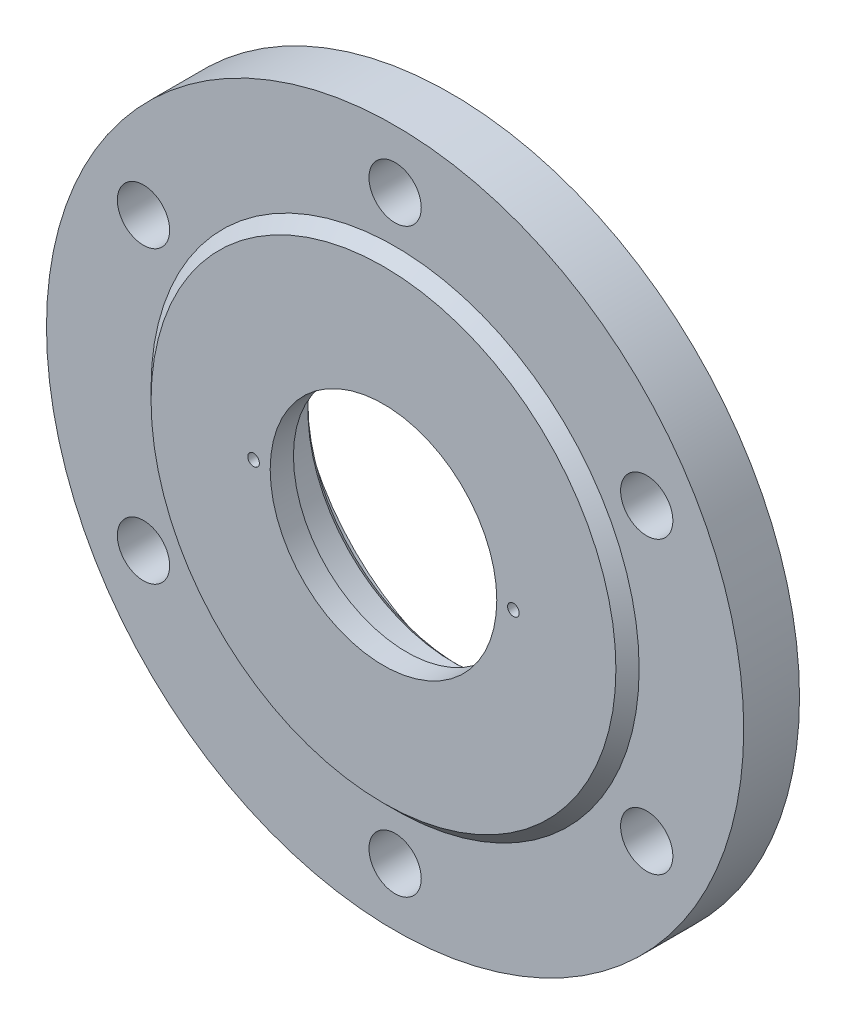
ISO-10303-21;
HEADER;
FILE_DESCRIPTION(('STEP AP214'),'2;1');
FILE_NAME('part.step','',(''),(''),'','','');
FILE_SCHEMA(('AUTOMOTIVE_DESIGN { 1 0 10303 214 1 1 1 1 }'));
ENDSEC;
DATA;
#1=APPLICATION_CONTEXT('core data for automotive mechanical design processes');
#2=APPLICATION_PROTOCOL_DEFINITION('international standard','automotive_design',2000,#1);
#3=PRODUCT_CONTEXT('',#1,'mechanical');
#4=PRODUCT('Part','Part','',(#3));
#5=PRODUCT_RELATED_PRODUCT_CATEGORY('part','',(#4));
#6=PRODUCT_DEFINITION_FORMATION('','',#4);
#7=PRODUCT_DEFINITION_CONTEXT('part definition',#1,'design');
#8=PRODUCT_DEFINITION('design','',#6,#7);
#9=PRODUCT_DEFINITION_SHAPE('','',#8);
#10=(LENGTH_UNIT() NAMED_UNIT(*) SI_UNIT(.MILLI.,.METRE.));
#11=(NAMED_UNIT(*) PLANE_ANGLE_UNIT() SI_UNIT($,.RADIAN.));
#12=(NAMED_UNIT(*) SI_UNIT($,.STERADIAN.) SOLID_ANGLE_UNIT());
#13=UNCERTAINTY_MEASURE_WITH_UNIT(LENGTH_MEASURE(1.E-05),#10,'distance_accuracy_value','');
#14=(GEOMETRIC_REPRESENTATION_CONTEXT(3) GLOBAL_UNCERTAINTY_ASSIGNED_CONTEXT((#13)) GLOBAL_UNIT_ASSIGNED_CONTEXT((#10,
#11,#12)) REPRESENTATION_CONTEXT('',''));
#15=CARTESIAN_POINT('',(0.,0.,0.));
#16=DIRECTION('',(0.,0.,1.));
#17=DIRECTION('',(1.,0.,0.));
#18=AXIS2_PLACEMENT_3D('',#15,#16,#17);
#19=CARTESIAN_POINT('',(0.,0.,-2.));
#20=DIRECTION('',(0.,0.,-1.));
#21=DIRECTION('',(-1.,0.,0.));
#22=AXIS2_PLACEMENT_3D('',#19,#20,#21);
#23=CONICAL_SURFACE('',#22,42.,0.785398163397449);
#24=CARTESIAN_POINT('',(0.,0.,0.));
#25=DIRECTION('',(0.,0.,1.));
#26=DIRECTION('',(1.,0.,0.));
#27=AXIS2_PLACEMENT_3D('',#24,#25,#26);
#28=CIRCLE('',#27,40.);
#29=CARTESIAN_POINT('',(40.,0.,0.));
#30=VERTEX_POINT('',#29);
#31=EDGE_CURVE('E10',#30,#30,#28,.T.);
#32=ORIENTED_EDGE('',*,*,#31,.F.);
#33=EDGE_LOOP('',(#32));
#34=FACE_BOUND('',#33,.T.);
#35=CARTESIAN_POINT('',(0.,0.,-2.));
#36=DIRECTION('',(0.,0.,1.));
#37=DIRECTION('',(1.,0.,0.));
#38=AXIS2_PLACEMENT_3D('',#35,#36,#37);
#39=CIRCLE('',#38,42.);
#40=CARTESIAN_POINT('',(42.,0.,-2.));
#41=VERTEX_POINT('',#40);
#42=EDGE_CURVE('E91',#41,#41,#39,.T.);
#43=ORIENTED_EDGE('',*,*,#42,.T.);
#44=EDGE_LOOP('',(#43));
#45=FACE_BOUND('',#44,.T.);
#46=ADVANCED_FACE('F39',(#34,#45),#23,.T.);
#47=CARTESIAN_POINT('',(0.,19.5,0.));
#48=DIRECTION('',(0.,0.,-1.));
#49=DIRECTION('',(-1.,0.,0.));
#50=AXIS2_PLACEMENT_3D('',#47,#48,#49);
#51=PLANE('',#50);
#52=CARTESIAN_POINT('',(-22.3599999999999,0.,0.));
#53=DIRECTION('',(0.,0.,1.));
#54=DIRECTION('',(1.,0.,0.));
#55=AXIS2_PLACEMENT_3D('',#52,#53,#54);
#56=CIRCLE('',#55,1.);
#57=CARTESIAN_POINT('',(-21.3599999999999,0.,0.));
#58=VERTEX_POINT('',#57);
#59=EDGE_CURVE('E134',#58,#58,#56,.T.);
#60=ORIENTED_EDGE('',*,*,#59,.F.);
#61=EDGE_LOOP('',(#60));
#62=FACE_BOUND('',#61,.T.);
#63=CARTESIAN_POINT('',(22.3600000000001,0.,0.));
#64=DIRECTION('',(0.,0.,1.));
#65=DIRECTION('',(-1.,0.,0.));
#66=AXIS2_PLACEMENT_3D('',#63,#64,#65);
#67=CIRCLE('',#66,1.);
#68=CARTESIAN_POINT('',(21.3600000000001,0.,0.));
#69=VERTEX_POINT('',#68);
#70=EDGE_CURVE('E135',#69,#69,#67,.T.);
#71=ORIENTED_EDGE('',*,*,#70,.F.);
#72=EDGE_LOOP('',(#71));
#73=FACE_BOUND('',#72,.T.);
#74=CARTESIAN_POINT('',(0.,0.,0.));
#75=DIRECTION('',(0.,0.,1.));
#76=DIRECTION('',(1.,0.,0.));
#77=AXIS2_PLACEMENT_3D('',#74,#75,#76);
#78=CIRCLE('',#77,19.5);
#79=CARTESIAN_POINT('',(19.5,0.,0.));
#80=VERTEX_POINT('',#79);
#81=EDGE_CURVE('E45',#80,#80,#78,.T.);
#82=ORIENTED_EDGE('',*,*,#81,.F.);
#83=EDGE_LOOP('',(#82));
#84=FACE_BOUND('',#83,.T.);
#85=ORIENTED_EDGE('',*,*,#31,.T.);
#86=EDGE_LOOP('',(#85));
#87=FACE_BOUND('',#86,.T.);
#88=ADVANCED_FACE('F146',(#62,#73,#84,#87),#51,.F.);
#89=CARTESIAN_POINT('',(0.,0.,0.));
#90=DIRECTION('',(0.,0.,1.));
#91=DIRECTION('',(1.,0.,0.));
#92=AXIS2_PLACEMENT_3D('',#89,#90,#91);
#93=CYLINDRICAL_SURFACE('',#92,19.5);
#94=CARTESIAN_POINT('',(0.,0.,-4.));
#95=DIRECTION('',(0.,0.,1.));
#96=DIRECTION('',(1.,0.,0.));
#97=AXIS2_PLACEMENT_3D('',#94,#95,#96);
#98=CIRCLE('',#97,19.5);
#99=CARTESIAN_POINT('',(19.5,0.,-4.));
#100=VERTEX_POINT('',#99);
#101=EDGE_CURVE('E49',#100,#100,#98,.T.);
#102=ORIENTED_EDGE('',*,*,#101,.F.);
#103=EDGE_LOOP('',(#102));
#104=FACE_BOUND('',#103,.T.);
#105=ORIENTED_EDGE('',*,*,#81,.T.);
#106=EDGE_LOOP('',(#105));
#107=FACE_BOUND('',#106,.T.);
#108=ADVANCED_FACE('F149',(#104,#107),#93,.F.);
#109=CARTESIAN_POINT('',(0.,25.,-4.));
#110=DIRECTION('',(0.,0.,1.));
#111=DIRECTION('',(1.,0.,0.));
#112=AXIS2_PLACEMENT_3D('',#109,#110,#111);
#113=PLANE('',#112);
#114=CARTESIAN_POINT('',(-22.3599999999999,0.,-4.));
#115=DIRECTION('',(0.,0.,1.));
#116=DIRECTION('',(1.,0.,0.));
#117=AXIS2_PLACEMENT_3D('',#114,#115,#116);
#118=CIRCLE('',#117,1.);
#119=CARTESIAN_POINT('',(-21.3599999999999,0.,-4.));
#120=VERTEX_POINT('',#119);
#121=EDGE_CURVE('E126',#120,#120,#118,.F.);
#122=ORIENTED_EDGE('',*,*,#121,.F.);
#123=EDGE_LOOP('',(#122));
#124=FACE_BOUND('',#123,.T.);
#125=CARTESIAN_POINT('',(22.3600000000001,0.,-4.));
#126=DIRECTION('',(0.,0.,1.));
#127=DIRECTION('',(1.,0.,0.));
#128=AXIS2_PLACEMENT_3D('',#125,#126,#127);
#129=CIRCLE('',#128,1.);
#130=CARTESIAN_POINT('',(23.3600000000001,0.,-4.));
#131=VERTEX_POINT('',#130);
#132=EDGE_CURVE('E131',#131,#131,#129,.F.);
#133=ORIENTED_EDGE('',*,*,#132,.F.);
#134=EDGE_LOOP('',(#133));
#135=FACE_BOUND('',#134,.T.);
#136=CARTESIAN_POINT('',(0.,0.,-4.));
#137=DIRECTION('',(0.,0.,1.));
#138=DIRECTION('',(1.,0.,0.));
#139=AXIS2_PLACEMENT_3D('',#136,#137,#138);
#140=CIRCLE('',#139,25.);
#141=CARTESIAN_POINT('',(25.,0.,-4.));
#142=VERTEX_POINT('',#141);
#143=EDGE_CURVE('E53',#142,#142,#140,.T.);
#144=ORIENTED_EDGE('',*,*,#143,.F.);
#145=EDGE_LOOP('',(#144));
#146=FACE_BOUND('',#145,.T.);
#147=ORIENTED_EDGE('',*,*,#101,.T.);
#148=EDGE_LOOP('',(#147));
#149=FACE_BOUND('',#148,.T.);
#150=ADVANCED_FACE('F160',(#124,#135,#146,#149),#113,.F.);
#151=CARTESIAN_POINT('',(0.,0.,0.));
#152=DIRECTION('',(0.,0.,1.));
#153=DIRECTION('',(1.,0.,0.));
#154=AXIS2_PLACEMENT_3D('',#151,#152,#153);
#155=CYLINDRICAL_SURFACE('',#154,25.);
#156=CARTESIAN_POINT('',(0.,0.,-12.));
#157=DIRECTION('',(0.,0.,1.));
#158=DIRECTION('',(1.,0.,0.));
#159=AXIS2_PLACEMENT_3D('',#156,#157,#158);
#160=CIRCLE('',#159,25.);
#161=CARTESIAN_POINT('',(25.,0.,-12.));
#162=VERTEX_POINT('',#161);
#163=EDGE_CURVE('E58',#162,#162,#160,.T.);
#164=ORIENTED_EDGE('',*,*,#163,.F.);
#165=EDGE_LOOP('',(#164));
#166=FACE_BOUND('',#165,.T.);
#167=ORIENTED_EDGE('',*,*,#143,.T.);
#168=EDGE_LOOP('',(#167));
#169=FACE_BOUND('',#168,.T.);
#170=ADVANCED_FACE('F163',(#166,#169),#155,.F.);
#171=CARTESIAN_POINT('',(0.,0.,-12.));
#172=DIRECTION('',(0.,0.,-1.));
#173=DIRECTION('',(-1.,0.,0.));
#174=AXIS2_PLACEMENT_3D('',#171,#172,#173);
#175=CONICAL_SURFACE('',#174,25.,0.78539816339745);
#176=CARTESIAN_POINT('',(0.,0.,-13.));
#177=DIRECTION('',(0.,0.,1.));
#178=DIRECTION('',(1.,0.,0.));
#179=AXIS2_PLACEMENT_3D('',#176,#177,#178);
#180=CIRCLE('',#179,26.);
#181=CARTESIAN_POINT('',(26.,0.,-13.));
#182=VERTEX_POINT('',#181);
#183=EDGE_CURVE('E61',#182,#182,#180,.T.);
#184=ORIENTED_EDGE('',*,*,#183,.F.);
#185=EDGE_LOOP('',(#184));
#186=FACE_BOUND('',#185,.T.);
#187=ORIENTED_EDGE('',*,*,#163,.T.);
#188=EDGE_LOOP('',(#187));
#189=FACE_BOUND('',#188,.T.);
#190=ADVANCED_FACE('F242',(#186,#189),#175,.F.);
#191=CARTESIAN_POINT('',(0.,26.,-13.));
#192=DIRECTION('',(0.,0.,1.));
#193=DIRECTION('',(1.,0.,0.));
#194=AXIS2_PLACEMENT_3D('',#191,#192,#193);
#195=PLANE('',#194);
#196=CARTESIAN_POINT('',(0.,0.,-13.));
#197=DIRECTION('',(0.,0.,1.));
#198=DIRECTION('',(1.,0.,0.));
#199=AXIS2_PLACEMENT_3D('',#196,#197,#198);
#200=CIRCLE('',#199,34.);
#201=CARTESIAN_POINT('',(34.,0.,-13.));
#202=VERTEX_POINT('',#201);
#203=EDGE_CURVE('E64',#202,#202,#200,.T.);
#204=ORIENTED_EDGE('',*,*,#203,.F.);
#205=EDGE_LOOP('',(#204));
#206=FACE_BOUND('',#205,.T.);
#207=ORIENTED_EDGE('',*,*,#183,.T.);
#208=EDGE_LOOP('',(#207));
#209=FACE_BOUND('',#208,.T.);
#210=ADVANCED_FACE('F236',(#206,#209),#195,.F.);
#211=CARTESIAN_POINT('',(0.,0.,-14.));
#212=DIRECTION('',(0.,0.,1.));
#213=DIRECTION('',(1.,0.,0.));
#214=AXIS2_PLACEMENT_3D('',#211,#212,#213);
#215=TOROIDAL_SURFACE('',#214,34.,0.999999999999997);
#216=CARTESIAN_POINT('',(0.,0.,-14.));
#217=DIRECTION('',(0.,0.,1.));
#218=DIRECTION('',(1.,0.,0.));
#219=AXIS2_PLACEMENT_3D('',#216,#217,#218);
#220=CIRCLE('',#219,35.);
#221=CARTESIAN_POINT('',(35.,0.,-14.));
#222=VERTEX_POINT('',#221);
#223=EDGE_CURVE('E67',#222,#222,#220,.T.);
#224=ORIENTED_EDGE('',*,*,#223,.F.);
#225=EDGE_LOOP('',(#224));
#226=FACE_BOUND('',#225,.T.);
#227=ORIENTED_EDGE('',*,*,#203,.T.);
#228=EDGE_LOOP('',(#227));
#229=FACE_BOUND('',#228,.T.);
#230=ADVANCED_FACE('F230',(#226,#229),#215,.F.);
#231=CARTESIAN_POINT('',(0.,0.,0.));
#232=DIRECTION('',(0.,0.,1.));
#233=DIRECTION('',(1.,0.,0.));
#234=AXIS2_PLACEMENT_3D('',#231,#232,#233);
#235=CYLINDRICAL_SURFACE('',#234,35.);
#236=CARTESIAN_POINT('',(0.,0.,-19.85));
#237=DIRECTION('',(0.,0.,1.));
#238=DIRECTION('',(1.,0.,0.));
#239=AXIS2_PLACEMENT_3D('',#236,#237,#238);
#240=CIRCLE('',#239,35.);
#241=CARTESIAN_POINT('',(35.,0.,-19.85));
#242=VERTEX_POINT('',#241);
#243=EDGE_CURVE('E70',#242,#242,#240,.T.);
#244=ORIENTED_EDGE('',*,*,#243,.F.);
#245=EDGE_LOOP('',(#244));
#246=FACE_BOUND('',#245,.T.);
#247=ORIENTED_EDGE('',*,*,#223,.T.);
#248=EDGE_LOOP('',(#247));
#249=FACE_BOUND('',#248,.T.);
#250=ADVANCED_FACE('F224',(#246,#249),#235,.F.);
#251=CARTESIAN_POINT('',(0.,35.,-19.85));
#252=DIRECTION('',(0.,0.,1.));
#253=DIRECTION('',(1.,0.,0.));
#254=AXIS2_PLACEMENT_3D('',#251,#252,#253);
#255=PLANE('',#254);
#256=CARTESIAN_POINT('',(0.,0.,-19.85));
#257=DIRECTION('',(0.,0.,1.));
#258=DIRECTION('',(1.,0.,0.));
#259=AXIS2_PLACEMENT_3D('',#256,#257,#258);
#260=CIRCLE('',#259,39.);
#261=CARTESIAN_POINT('',(39.,0.,-19.85));
#262=VERTEX_POINT('',#261);
#263=EDGE_CURVE('E73',#262,#262,#260,.T.);
#264=ORIENTED_EDGE('',*,*,#263,.F.);
#265=EDGE_LOOP('',(#264));
#266=FACE_BOUND('',#265,.T.);
#267=ORIENTED_EDGE('',*,*,#243,.T.);
#268=EDGE_LOOP('',(#267));
#269=FACE_BOUND('',#268,.T.);
#270=ADVANCED_FACE('F218',(#266,#269),#255,.F.);
#271=CARTESIAN_POINT('',(0.,0.,0.));
#272=DIRECTION('',(0.,0.,1.));
#273=DIRECTION('',(1.,0.,0.));
#274=AXIS2_PLACEMENT_3D('',#271,#272,#273);
#275=CYLINDRICAL_SURFACE('',#274,39.);
#276=CARTESIAN_POINT('',(0.,0.,-17.6));
#277=DIRECTION('',(0.,0.,1.));
#278=DIRECTION('',(1.,0.,0.));
#279=AXIS2_PLACEMENT_3D('',#276,#277,#278);
#280=CIRCLE('',#279,39.);
#281=CARTESIAN_POINT('',(39.,0.,-17.6));
#282=VERTEX_POINT('',#281);
#283=EDGE_CURVE('E76',#282,#282,#280,.T.);
#284=ORIENTED_EDGE('',*,*,#283,.F.);
#285=EDGE_LOOP('',(#284));
#286=FACE_BOUND('',#285,.T.);
#287=ORIENTED_EDGE('',*,*,#263,.T.);
#288=EDGE_LOOP('',(#287));
#289=FACE_BOUND('',#288,.T.);
#290=ADVANCED_FACE('F212',(#286,#289),#275,.T.);
#291=CARTESIAN_POINT('',(0.,0.,-17.6));
#292=DIRECTION('',(0.,0.,1.));
#293=DIRECTION('',(1.,0.,0.));
#294=AXIS2_PLACEMENT_3D('',#291,#292,#293);
#295=TOROIDAL_SURFACE('',#294,40.,1.);
#296=CARTESIAN_POINT('',(0.,0.,-16.6));
#297=DIRECTION('',(0.,0.,1.));
#298=DIRECTION('',(1.,0.,0.));
#299=AXIS2_PLACEMENT_3D('',#296,#297,#298);
#300=CIRCLE('',#299,40.);
#301=CARTESIAN_POINT('',(40.,0.,-16.6));
#302=VERTEX_POINT('',#301);
#303=EDGE_CURVE('E79',#302,#302,#300,.T.);
#304=ORIENTED_EDGE('',*,*,#303,.F.);
#305=EDGE_LOOP('',(#304));
#306=FACE_BOUND('',#305,.T.);
#307=ORIENTED_EDGE('',*,*,#283,.T.);
#308=EDGE_LOOP('',(#307));
#309=FACE_BOUND('',#308,.T.);
#310=ADVANCED_FACE('F206',(#306,#309),#295,.F.);
#311=CARTESIAN_POINT('',(0.,0.,0.));
#312=DIRECTION('',(0.,0.,1.));
#313=DIRECTION('',(1.,0.,0.));
#314=AXIS2_PLACEMENT_3D('',#311,#312,#313);
#315=CYLINDRICAL_SURFACE('',#314,40.);
#316=CARTESIAN_POINT('',(0.,0.,-11.6));
#317=DIRECTION('',(0.,0.,1.));
#318=DIRECTION('',(1.,0.,0.));
#319=AXIS2_PLACEMENT_3D('',#316,#317,#318);
#320=CIRCLE('',#319,40.);
#321=CARTESIAN_POINT('',(40.,0.,-11.6));
#322=VERTEX_POINT('',#321);
#323=EDGE_CURVE('E82',#322,#322,#320,.T.);
#324=ORIENTED_EDGE('',*,*,#323,.F.);
#325=EDGE_LOOP('',(#324));
#326=FACE_BOUND('',#325,.T.);
#327=ORIENTED_EDGE('',*,*,#303,.T.);
#328=EDGE_LOOP('',(#327));
#329=FACE_BOUND('',#328,.T.);
#330=ADVANCED_FACE('F199',(#326,#329),#315,.T.);
#331=CARTESIAN_POINT('',(0.,60.,-11.6));
#332=DIRECTION('',(0.,0.,1.));
#333=DIRECTION('',(1.,0.,0.));
#334=AXIS2_PLACEMENT_3D('',#331,#332,#333);
#335=PLANE('',#334);
#336=CARTESIAN_POINT('',(0.,-50.,-11.6));
#337=DIRECTION('',(0.,0.,1.));
#338=DIRECTION('',(1.,0.,0.));
#339=AXIS2_PLACEMENT_3D('',#336,#337,#338);
#340=CIRCLE('',#339,4.50000000000002);
#341=CARTESIAN_POINT('',(4.50000000000002,-50.,-11.6));
#342=VERTEX_POINT('',#341);
#343=EDGE_CURVE('E94',#342,#342,#340,.F.);
#344=ORIENTED_EDGE('',*,*,#343,.F.);
#345=EDGE_LOOP('',(#344));
#346=FACE_BOUND('',#345,.T.);
#347=CARTESIAN_POINT('',(43.3012701892219,-25.,-11.6));
#348=DIRECTION('',(0.,0.,1.));
#349=DIRECTION('',(1.,0.,0.));
#350=AXIS2_PLACEMENT_3D('',#347,#348,#349);
#351=CIRCLE('',#350,4.49999999999999);
#352=CARTESIAN_POINT('',(47.8012701892219,-25.,-11.6));
#353=VERTEX_POINT('',#352);
#354=EDGE_CURVE('E116',#353,#353,#351,.F.);
#355=ORIENTED_EDGE('',*,*,#354,.F.);
#356=EDGE_LOOP('',(#355));
#357=FACE_BOUND('',#356,.T.);
#358=CARTESIAN_POINT('',(43.3012701892219,25.,-11.6));
#359=DIRECTION('',(0.,0.,1.));
#360=DIRECTION('',(1.,0.,0.));
#361=AXIS2_PLACEMENT_3D('',#358,#359,#360);
#362=CIRCLE('',#361,4.5);
#363=CARTESIAN_POINT('',(47.8012701892219,25.,-11.6));
#364=VERTEX_POINT('',#363);
#365=EDGE_CURVE('E103',#364,#364,#362,.F.);
#366=ORIENTED_EDGE('',*,*,#365,.F.);
#367=EDGE_LOOP('',(#366));
#368=FACE_BOUND('',#367,.T.);
#369=CARTESIAN_POINT('',(-43.3012701892219,-25.,-11.6));
#370=DIRECTION('',(0.,0.,1.));
#371=DIRECTION('',(1.,0.,0.));
#372=AXIS2_PLACEMENT_3D('',#369,#370,#371);
#373=CIRCLE('',#372,4.5);
#374=CARTESIAN_POINT('',(-38.8012701892219,-25.,-11.6));
#375=VERTEX_POINT('',#374);
#376=EDGE_CURVE('E95',#375,#375,#373,.F.);
#377=ORIENTED_EDGE('',*,*,#376,.F.);
#378=EDGE_LOOP('',(#377));
#379=FACE_BOUND('',#378,.T.);
#380=CARTESIAN_POINT('',(-43.3012701892219,25.,-11.6));
#381=DIRECTION('',(0.,0.,1.));
#382=DIRECTION('',(1.,0.,0.));
#383=AXIS2_PLACEMENT_3D('',#380,#381,#382);
#384=CIRCLE('',#383,4.50000000000003);
#385=CARTESIAN_POINT('',(-38.8012701892219,25.,-11.6));
#386=VERTEX_POINT('',#385);
#387=EDGE_CURVE('E102',#386,#386,#384,.F.);
#388=ORIENTED_EDGE('',*,*,#387,.F.);
#389=EDGE_LOOP('',(#388));
#390=FACE_BOUND('',#389,.T.);
#391=CARTESIAN_POINT('',(0.,50.,-11.6));
#392=DIRECTION('',(0.,0.,1.));
#393=DIRECTION('',(1.,0.,0.));
#394=AXIS2_PLACEMENT_3D('',#391,#392,#393);
#395=CIRCLE('',#394,4.49999999999999);
#396=CARTESIAN_POINT('',(4.49999999999999,50.,-11.6));
#397=VERTEX_POINT('',#396);
#398=EDGE_CURVE('E109',#397,#397,#395,.F.);
#399=ORIENTED_EDGE('',*,*,#398,.F.);
#400=EDGE_LOOP('',(#399));
#401=FACE_BOUND('',#400,.T.);
#402=CARTESIAN_POINT('',(0.,0.,-11.6));
#403=DIRECTION('',(0.,0.,1.));
#404=DIRECTION('',(1.,0.,0.));
#405=AXIS2_PLACEMENT_3D('',#402,#403,#404);
#406=CIRCLE('',#405,60.);
#407=CARTESIAN_POINT('',(60.,0.,-11.6));
#408=VERTEX_POINT('',#407);
#409=EDGE_CURVE('E85',#408,#408,#406,.T.);
#410=ORIENTED_EDGE('',*,*,#409,.F.);
#411=EDGE_LOOP('',(#410));
#412=FACE_BOUND('',#411,.T.);
#413=ORIENTED_EDGE('',*,*,#323,.T.);
#414=EDGE_LOOP('',(#413));
#415=FACE_BOUND('',#414,.T.);
#416=ADVANCED_FACE('F193',(#346,#357,#368,#379,#390,#401,#412,#415),#335,.F.);
#417=CARTESIAN_POINT('',(0.,0.,0.));
#418=DIRECTION('',(0.,0.,1.));
#419=DIRECTION('',(1.,0.,0.));
#420=AXIS2_PLACEMENT_3D('',#417,#418,#419);
#421=CYLINDRICAL_SURFACE('',#420,60.);
#422=CARTESIAN_POINT('',(0.,0.,-2.));
#423=DIRECTION('',(0.,0.,1.));
#424=DIRECTION('',(1.,0.,0.));
#425=AXIS2_PLACEMENT_3D('',#422,#423,#424);
#426=CIRCLE('',#425,60.);
#427=CARTESIAN_POINT('',(60.,0.,-2.));
#428=VERTEX_POINT('',#427);
#429=EDGE_CURVE('E88',#428,#428,#426,.T.);
#430=ORIENTED_EDGE('',*,*,#429,.F.);
#431=EDGE_LOOP('',(#430));
#432=FACE_BOUND('',#431,.T.);
#433=ORIENTED_EDGE('',*,*,#409,.T.);
#434=EDGE_LOOP('',(#433));
#435=FACE_BOUND('',#434,.T.);
#436=ADVANCED_FACE('F186',(#432,#435),#421,.T.);
#437=CARTESIAN_POINT('',(0.,42.,-2.));
#438=DIRECTION('',(0.,0.,-1.));
#439=DIRECTION('',(-1.,0.,0.));
#440=AXIS2_PLACEMENT_3D('',#437,#438,#439);
#441=PLANE('',#440);
#442=CARTESIAN_POINT('',(0.,-50.,-2.));
#443=DIRECTION('',(0.,0.,1.));
#444=DIRECTION('',(1.,0.,0.));
#445=AXIS2_PLACEMENT_3D('',#442,#443,#444);
#446=CIRCLE('',#445,4.50000000000002);
#447=CARTESIAN_POINT('',(4.50000000000002,-50.,-2.));
#448=VERTEX_POINT('',#447);
#449=EDGE_CURVE('E106',#448,#448,#446,.T.);
#450=ORIENTED_EDGE('',*,*,#449,.F.);
#451=EDGE_LOOP('',(#450));
#452=FACE_BOUND('',#451,.T.);
#453=CARTESIAN_POINT('',(43.3012701892219,-25.,-2.));
#454=DIRECTION('',(0.,0.,1.));
#455=DIRECTION('',(1.,0.,0.));
#456=AXIS2_PLACEMENT_3D('',#453,#454,#455);
#457=CIRCLE('',#456,4.49999999999999);
#458=CARTESIAN_POINT('',(47.8012701892219,-25.,-2.));
#459=VERTEX_POINT('',#458);
#460=EDGE_CURVE('E123',#459,#459,#457,.T.);
#461=ORIENTED_EDGE('',*,*,#460,.F.);
#462=EDGE_LOOP('',(#461));
#463=FACE_BOUND('',#462,.T.);
#464=CARTESIAN_POINT('',(43.3012701892219,25.,-2.));
#465=DIRECTION('',(0.,0.,1.));
#466=DIRECTION('',(1.,0.,0.));
#467=AXIS2_PLACEMENT_3D('',#464,#465,#466);
#468=CIRCLE('',#467,4.5);
#469=CARTESIAN_POINT('',(47.8012701892219,25.,-2.));
#470=VERTEX_POINT('',#469);
#471=EDGE_CURVE('E98',#470,#470,#468,.T.);
#472=ORIENTED_EDGE('',*,*,#471,.F.);
#473=EDGE_LOOP('',(#472));
#474=FACE_BOUND('',#473,.T.);
#475=CARTESIAN_POINT('',(-43.3012701892219,-25.,-2.));
#476=DIRECTION('',(0.,0.,1.));
#477=DIRECTION('',(1.,0.,0.));
#478=AXIS2_PLACEMENT_3D('',#475,#476,#477);
#479=CIRCLE('',#478,4.5);
#480=CARTESIAN_POINT('',(-38.8012701892219,-25.,-2.));
#481=VERTEX_POINT('',#480);
#482=EDGE_CURVE('E99',#481,#481,#479,.T.);
#483=ORIENTED_EDGE('',*,*,#482,.F.);
#484=EDGE_LOOP('',(#483));
#485=FACE_BOUND('',#484,.T.);
#486=CARTESIAN_POINT('',(-43.3012701892219,25.,-2.));
#487=DIRECTION('',(0.,0.,1.));
#488=DIRECTION('',(1.,0.,0.));
#489=AXIS2_PLACEMENT_3D('',#486,#487,#488);
#490=CIRCLE('',#489,4.50000000000003);
#491=CARTESIAN_POINT('',(-38.8012701892219,25.,-2.));
#492=VERTEX_POINT('',#491);
#493=EDGE_CURVE('E112',#492,#492,#490,.T.);
#494=ORIENTED_EDGE('',*,*,#493,.F.);
#495=EDGE_LOOP('',(#494));
#496=FACE_BOUND('',#495,.T.);
#497=CARTESIAN_POINT('',(0.,50.,-2.));
#498=DIRECTION('',(0.,0.,1.));
#499=DIRECTION('',(1.,0.,0.));
#500=AXIS2_PLACEMENT_3D('',#497,#498,#499);
#501=CIRCLE('',#500,4.49999999999999);
#502=CARTESIAN_POINT('',(4.49999999999999,50.,-2.));
#503=VERTEX_POINT('',#502);
#504=EDGE_CURVE('E113',#503,#503,#501,.T.);
#505=ORIENTED_EDGE('',*,*,#504,.F.);
#506=EDGE_LOOP('',(#505));
#507=FACE_BOUND('',#506,.T.);
#508=ORIENTED_EDGE('',*,*,#42,.F.);
#509=EDGE_LOOP('',(#508));
#510=FACE_BOUND('',#509,.T.);
#511=ORIENTED_EDGE('',*,*,#429,.T.);
#512=EDGE_LOOP('',(#511));
#513=FACE_BOUND('',#512,.T.);
#514=ADVANCED_FACE('F182',(#452,#463,#474,#485,#496,#507,#510,#513),#441,.F.);
#515=CARTESIAN_POINT('',(0.,50.,-19.851));
#516=DIRECTION('',(0.,0.,1.));
#517=DIRECTION('',(1.,0.,0.));
#518=AXIS2_PLACEMENT_3D('',#515,#516,#517);
#519=CYLINDRICAL_SURFACE('',#518,4.49999999999999);
#520=ORIENTED_EDGE('',*,*,#504,.T.);
#521=EDGE_LOOP('',(#520));
#522=FACE_BOUND('',#521,.T.);
#523=ORIENTED_EDGE('',*,*,#398,.T.);
#524=EDGE_LOOP('',(#523));
#525=FACE_BOUND('',#524,.T.);
#526=ADVANCED_FACE('F185',(#522,#525),#519,.F.);
#527=CARTESIAN_POINT('',(-43.3012701892219,25.,-19.851));
#528=DIRECTION('',(0.,0.,1.));
#529=DIRECTION('',(1.,0.,0.));
#530=AXIS2_PLACEMENT_3D('',#527,#528,#529);
#531=CYLINDRICAL_SURFACE('',#530,4.50000000000003);
#532=ORIENTED_EDGE('',*,*,#493,.T.);
#533=EDGE_LOOP('',(#532));
#534=FACE_BOUND('',#533,.T.);
#535=ORIENTED_EDGE('',*,*,#387,.T.);
#536=EDGE_LOOP('',(#535));
#537=FACE_BOUND('',#536,.T.);
#538=ADVANCED_FACE('F260',(#534,#537),#531,.F.);
#539=CARTESIAN_POINT('',(-43.3012701892219,-25.,-19.851));
#540=DIRECTION('',(0.,0.,1.));
#541=DIRECTION('',(1.,0.,0.));
#542=AXIS2_PLACEMENT_3D('',#539,#540,#541);
#543=CYLINDRICAL_SURFACE('',#542,4.5);
#544=ORIENTED_EDGE('',*,*,#482,.T.);
#545=EDGE_LOOP('',(#544));
#546=FACE_BOUND('',#545,.T.);
#547=ORIENTED_EDGE('',*,*,#376,.T.);
#548=EDGE_LOOP('',(#547));
#549=FACE_BOUND('',#548,.T.);
#550=ADVANCED_FACE('F256',(#546,#549),#543,.F.);
#551=CARTESIAN_POINT('',(43.3012701892219,25.,-19.851));
#552=DIRECTION('',(0.,0.,1.));
#553=DIRECTION('',(1.,0.,0.));
#554=AXIS2_PLACEMENT_3D('',#551,#552,#553);
#555=CYLINDRICAL_SURFACE('',#554,4.5);
#556=ORIENTED_EDGE('',*,*,#471,.T.);
#557=EDGE_LOOP('',(#556));
#558=FACE_BOUND('',#557,.T.);
#559=ORIENTED_EDGE('',*,*,#365,.T.);
#560=EDGE_LOOP('',(#559));
#561=FACE_BOUND('',#560,.T.);
#562=ADVANCED_FACE('F259',(#558,#561),#555,.F.);
#563=CARTESIAN_POINT('',(43.3012701892219,-25.,-19.851));
#564=DIRECTION('',(0.,0.,1.));
#565=DIRECTION('',(1.,0.,0.));
#566=AXIS2_PLACEMENT_3D('',#563,#564,#565);
#567=CYLINDRICAL_SURFACE('',#566,4.49999999999999);
#568=ORIENTED_EDGE('',*,*,#460,.T.);
#569=EDGE_LOOP('',(#568));
#570=FACE_BOUND('',#569,.T.);
#571=ORIENTED_EDGE('',*,*,#354,.T.);
#572=EDGE_LOOP('',(#571));
#573=FACE_BOUND('',#572,.T.);
#574=ADVANCED_FACE('F264',(#570,#573),#567,.F.);
#575=CARTESIAN_POINT('',(0.,-50.,-19.851));
#576=DIRECTION('',(0.,0.,1.));
#577=DIRECTION('',(1.,0.,0.));
#578=AXIS2_PLACEMENT_3D('',#575,#576,#577);
#579=CYLINDRICAL_SURFACE('',#578,4.50000000000002);
#580=ORIENTED_EDGE('',*,*,#449,.T.);
#581=EDGE_LOOP('',(#580));
#582=FACE_BOUND('',#581,.T.);
#583=ORIENTED_EDGE('',*,*,#343,.T.);
#584=EDGE_LOOP('',(#583));
#585=FACE_BOUND('',#584,.T.);
#586=ADVANCED_FACE('F156',(#582,#585),#579,.F.);
#587=CARTESIAN_POINT('',(22.3600000000001,0.,-19.851));
#588=DIRECTION('',(0.,0.,1.));
#589=DIRECTION('',(1.,0.,0.));
#590=AXIS2_PLACEMENT_3D('',#587,#588,#589);
#591=CYLINDRICAL_SURFACE('',#590,1.);
#592=ORIENTED_EDGE('',*,*,#70,.T.);
#593=EDGE_LOOP('',(#592));
#594=FACE_BOUND('',#593,.T.);
#595=ORIENTED_EDGE('',*,*,#132,.T.);
#596=EDGE_LOOP('',(#595));
#597=FACE_BOUND('',#596,.T.);
#598=ADVANCED_FACE('F153',(#594,#597),#591,.F.);
#599=CARTESIAN_POINT('',(-22.3599999999999,0.,-19.851));
#600=DIRECTION('',(0.,0.,1.));
#601=DIRECTION('',(1.,0.,0.));
#602=AXIS2_PLACEMENT_3D('',#599,#600,#601);
#603=CYLINDRICAL_SURFACE('',#602,1.);
#604=ORIENTED_EDGE('',*,*,#59,.T.);
#605=EDGE_LOOP('',(#604));
#606=FACE_BOUND('',#605,.T.);
#607=ORIENTED_EDGE('',*,*,#121,.T.);
#608=EDGE_LOOP('',(#607));
#609=FACE_BOUND('',#608,.T.);
#610=ADVANCED_FACE('F143',(#606,#609),#603,.F.);
#611=CLOSED_SHELL('',(#46,#88,#108,#150,#170,#190,#210,#230,#250,#270,#290,#310,#330,#416,#436,
#514,#526,#538,#550,#562,#574,#586,#598,#610));
#612=MANIFOLD_SOLID_BREP('B2',#611);
#613=ADVANCED_BREP_SHAPE_REPRESENTATION('',(#18,#612),#14);
#614=SHAPE_DEFINITION_REPRESENTATION(#9,#613);
ENDSEC;
END-ISO-10303-21;
